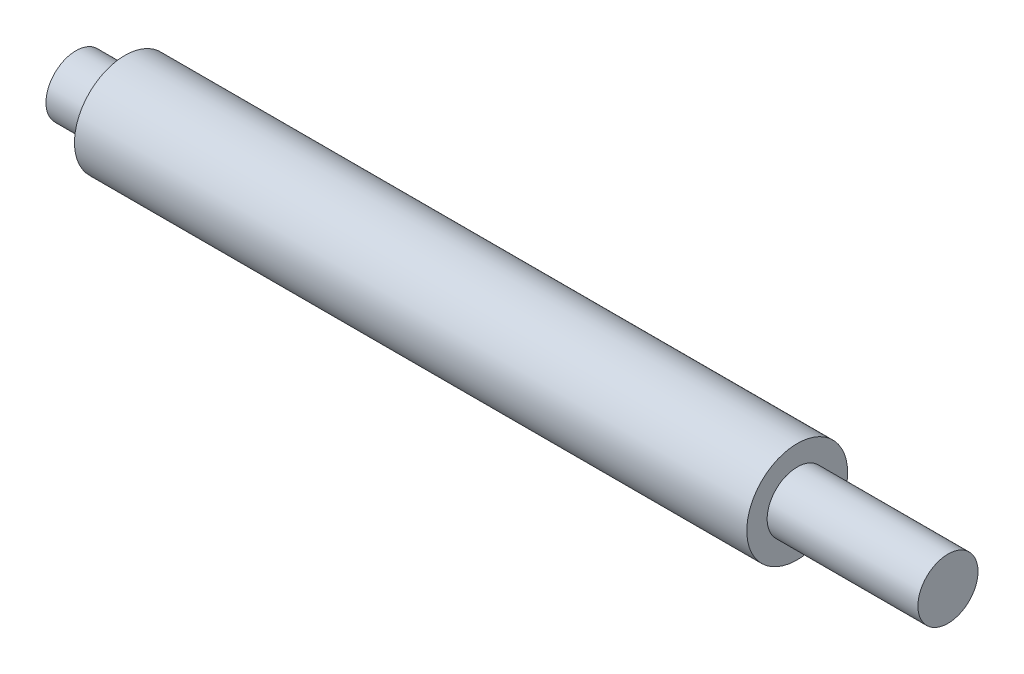
ISO-10303-21;
HEADER;
FILE_DESCRIPTION(('STEP AP214'),'2;1');
FILE_NAME('part.step','',(''),(''),'','','');
FILE_SCHEMA(('AUTOMOTIVE_DESIGN { 1 0 10303 214 1 1 1 1 }'));
ENDSEC;
DATA;
#1=APPLICATION_CONTEXT('core data for automotive mechanical design processes');
#2=APPLICATION_PROTOCOL_DEFINITION('international standard','automotive_design',2000,#1);
#3=PRODUCT_CONTEXT('',#1,'mechanical');
#4=PRODUCT('Part','Part','',(#3));
#5=PRODUCT_RELATED_PRODUCT_CATEGORY('part','',(#4));
#6=PRODUCT_DEFINITION_FORMATION('','',#4);
#7=PRODUCT_DEFINITION_CONTEXT('part definition',#1,'design');
#8=PRODUCT_DEFINITION('design','',#6,#7);
#9=PRODUCT_DEFINITION_SHAPE('','',#8);
#10=(LENGTH_UNIT() NAMED_UNIT(*) SI_UNIT(.MILLI.,.METRE.));
#11=(NAMED_UNIT(*) PLANE_ANGLE_UNIT() SI_UNIT($,.RADIAN.));
#12=(NAMED_UNIT(*) SI_UNIT($,.STERADIAN.) SOLID_ANGLE_UNIT());
#13=UNCERTAINTY_MEASURE_WITH_UNIT(LENGTH_MEASURE(1.E-05),#10,'distance_accuracy_value','');
#14=(GEOMETRIC_REPRESENTATION_CONTEXT(3) GLOBAL_UNCERTAINTY_ASSIGNED_CONTEXT((#13)) GLOBAL_UNIT_ASSIGNED_CONTEXT((#10,
#11,#12)) REPRESENTATION_CONTEXT('',''));
#15=CARTESIAN_POINT('',(0.,0.,0.));
#16=DIRECTION('',(0.,0.,1.));
#17=DIRECTION('',(1.,0.,0.));
#18=AXIS2_PLACEMENT_3D('',#15,#16,#17);
#19=CARTESIAN_POINT('',(4.8,0.,0.));
#20=DIRECTION('',(-1.,0.,0.));
#21=DIRECTION('',(0.,0.,1.));
#22=AXIS2_PLACEMENT_3D('',#19,#20,#21);
#23=CYLINDRICAL_SURFACE('',#22,2.95);
#24=CARTESIAN_POINT('',(4.8,0.,0.));
#25=DIRECTION('',(1.,0.,0.));
#26=DIRECTION('',(0.,0.,-1.));
#27=AXIS2_PLACEMENT_3D('',#24,#25,#26);
#28=CIRCLE('',#27,2.95);
#29=CARTESIAN_POINT('',(4.8,0.,-2.95));
#30=VERTEX_POINT('',#29);
#31=EDGE_CURVE('E42',#30,#30,#28,.T.);
#32=ORIENTED_EDGE('',*,*,#31,.F.);
#33=EDGE_LOOP('',(#32));
#34=FACE_BOUND('',#33,.T.);
#35=CARTESIAN_POINT('',(0.,0.,0.));
#36=DIRECTION('',(1.,0.,0.));
#37=DIRECTION('',(0.,0.,-1.));
#38=AXIS2_PLACEMENT_3D('',#35,#36,#37);
#39=CIRCLE('',#38,2.95);
#40=CARTESIAN_POINT('',(0.,0.,-2.95));
#41=VERTEX_POINT('',#40);
#42=EDGE_CURVE('E37',#41,#41,#39,.T.);
#43=ORIENTED_EDGE('',*,*,#42,.T.);
#44=EDGE_LOOP('',(#43));
#45=FACE_BOUND('',#44,.T.);
#46=ADVANCED_FACE('F40',(#34,#45),#23,.T.);
#47=CARTESIAN_POINT('',(0.,0.,0.));
#48=DIRECTION('',(1.,0.,0.));
#49=DIRECTION('',(0.,0.,-1.));
#50=AXIS2_PLACEMENT_3D('',#47,#48,#49);
#51=PLANE('',#50);
#52=ORIENTED_EDGE('',*,*,#42,.F.);
#53=EDGE_LOOP('',(#52));
#54=FACE_BOUND('',#53,.T.);
#55=ADVANCED_FACE('F78',(#54),#51,.F.);
#56=CARTESIAN_POINT('',(70.8,0.,0.));
#57=DIRECTION('',(-1.,0.,0.));
#58=DIRECTION('',(0.,0.,1.));
#59=AXIS2_PLACEMENT_3D('',#56,#57,#58);
#60=CYLINDRICAL_SURFACE('',#59,4.95);
#61=CARTESIAN_POINT('',(70.8,0.,0.));
#62=DIRECTION('',(1.,0.,0.));
#63=DIRECTION('',(0.,0.,-1.));
#64=AXIS2_PLACEMENT_3D('',#61,#62,#63);
#65=CIRCLE('',#64,4.95);
#66=CARTESIAN_POINT('',(70.8,0.,-4.95));
#67=VERTEX_POINT('',#66);
#68=EDGE_CURVE('E55',#67,#67,#65,.T.);
#69=ORIENTED_EDGE('',*,*,#68,.F.);
#70=EDGE_LOOP('',(#69));
#71=FACE_BOUND('',#70,.T.);
#72=CARTESIAN_POINT('',(4.8,0.,0.));
#73=DIRECTION('',(1.,0.,0.));
#74=DIRECTION('',(0.,0.,-1.));
#75=AXIS2_PLACEMENT_3D('',#72,#73,#74);
#76=CIRCLE('',#75,4.95);
#77=CARTESIAN_POINT('',(4.8,0.,-4.95));
#78=VERTEX_POINT('',#77);
#79=EDGE_CURVE('E54',#78,#78,#76,.T.);
#80=ORIENTED_EDGE('',*,*,#79,.T.);
#81=EDGE_LOOP('',(#80));
#82=FACE_BOUND('',#81,.T.);
#83=ADVANCED_FACE('F84',(#71,#82),#60,.T.);
#84=CARTESIAN_POINT('',(70.8,0.,0.));
#85=DIRECTION('',(1.,0.,0.));
#86=DIRECTION('',(0.,0.,-1.));
#87=AXIS2_PLACEMENT_3D('',#84,#85,#86);
#88=PLANE('',#87);
#89=CARTESIAN_POINT('',(70.8,0.,0.));
#90=DIRECTION('',(1.,0.,0.));
#91=DIRECTION('',(0.,0.,-1.));
#92=AXIS2_PLACEMENT_3D('',#89,#90,#91);
#93=CIRCLE('',#92,2.95);
#94=CARTESIAN_POINT('',(70.8,0.,-2.95));
#95=VERTEX_POINT('',#94);
#96=EDGE_CURVE('E10',#95,#95,#93,.T.);
#97=ORIENTED_EDGE('',*,*,#96,.F.);
#98=EDGE_LOOP('',(#97));
#99=FACE_BOUND('',#98,.T.);
#100=ORIENTED_EDGE('',*,*,#68,.T.);
#101=EDGE_LOOP('',(#100));
#102=FACE_BOUND('',#101,.T.);
#103=ADVANCED_FACE('F74',(#99,#102),#88,.T.);
#104=CARTESIAN_POINT('',(4.8,0.,0.));
#105=DIRECTION('',(1.,0.,0.));
#106=DIRECTION('',(0.,0.,-1.));
#107=AXIS2_PLACEMENT_3D('',#104,#105,#106);
#108=PLANE('',#107);
#109=ORIENTED_EDGE('',*,*,#31,.T.);
#110=EDGE_LOOP('',(#109));
#111=FACE_BOUND('',#110,.T.);
#112=ORIENTED_EDGE('',*,*,#79,.F.);
#113=EDGE_LOOP('',(#112));
#114=FACE_BOUND('',#113,.T.);
#115=ADVANCED_FACE('F67',(#111,#114),#108,.F.);
#116=CARTESIAN_POINT('',(85.6,0.,0.));
#117=DIRECTION('',(-1.,0.,0.));
#118=DIRECTION('',(0.,0.,1.));
#119=AXIS2_PLACEMENT_3D('',#116,#117,#118);
#120=CYLINDRICAL_SURFACE('',#119,2.95);
#121=CARTESIAN_POINT('',(85.6,0.,0.));
#122=DIRECTION('',(1.,0.,0.));
#123=DIRECTION('',(0.,0.,-1.));
#124=AXIS2_PLACEMENT_3D('',#121,#122,#123);
#125=CIRCLE('',#124,2.95);
#126=CARTESIAN_POINT('',(85.6,0.,-2.95));
#127=VERTEX_POINT('',#126);
#128=EDGE_CURVE('E51',#127,#127,#125,.T.);
#129=ORIENTED_EDGE('',*,*,#128,.F.);
#130=EDGE_LOOP('',(#129));
#131=FACE_BOUND('',#130,.T.);
#132=ORIENTED_EDGE('',*,*,#96,.T.);
#133=EDGE_LOOP('',(#132));
#134=FACE_BOUND('',#133,.T.);
#135=ADVANCED_FACE('F63',(#131,#134),#120,.T.);
#136=CARTESIAN_POINT('',(85.6,0.,0.));
#137=DIRECTION('',(1.,0.,0.));
#138=DIRECTION('',(0.,0.,-1.));
#139=AXIS2_PLACEMENT_3D('',#136,#137,#138);
#140=PLANE('',#139);
#141=ORIENTED_EDGE('',*,*,#128,.T.);
#142=EDGE_LOOP('',(#141));
#143=FACE_BOUND('',#142,.T.);
#144=ADVANCED_FACE('F62',(#143),#140,.T.);
#145=CLOSED_SHELL('',(#46,#55,#83,#103,#115,#135,#144));
#146=MANIFOLD_SOLID_BREP('B2',#145);
#147=ADVANCED_BREP_SHAPE_REPRESENTATION('',(#18,#146),#14);
#148=SHAPE_DEFINITION_REPRESENTATION(#9,#147);
ENDSEC;
END-ISO-10303-21;
